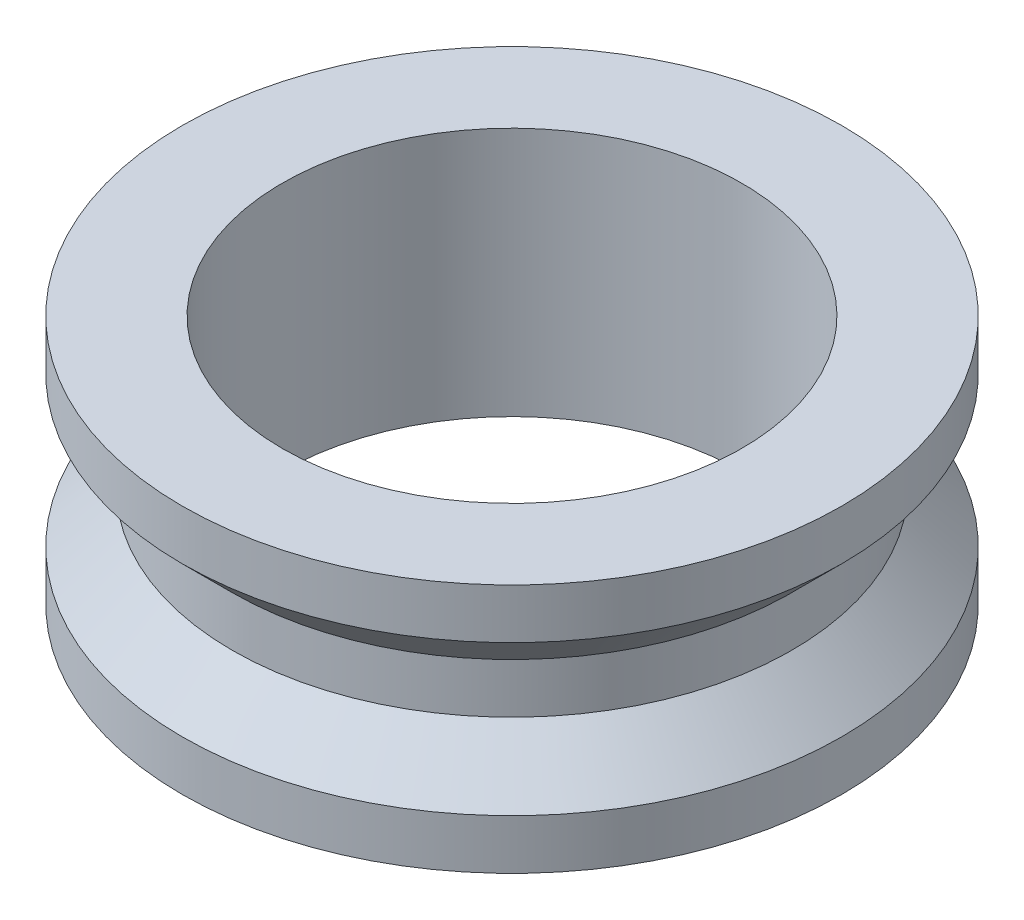
ISO-10303-21;
HEADER;
FILE_DESCRIPTION(('STEP AP214'),'2;1');
FILE_NAME('part.step','',(''),(''),'','','');
FILE_SCHEMA(('AUTOMOTIVE_DESIGN { 1 0 10303 214 1 1 1 1 }'));
ENDSEC;
DATA;
#1=APPLICATION_CONTEXT('core data for automotive mechanical design processes');
#2=APPLICATION_PROTOCOL_DEFINITION('international standard','automotive_design',2000,#1);
#3=PRODUCT_CONTEXT('',#1,'mechanical');
#4=PRODUCT('Part','Part','',(#3));
#5=PRODUCT_RELATED_PRODUCT_CATEGORY('part','',(#4));
#6=PRODUCT_DEFINITION_FORMATION('','',#4);
#7=PRODUCT_DEFINITION_CONTEXT('part definition',#1,'design');
#8=PRODUCT_DEFINITION('design','',#6,#7);
#9=PRODUCT_DEFINITION_SHAPE('','',#8);
#10=(LENGTH_UNIT() NAMED_UNIT(*) SI_UNIT(.MILLI.,.METRE.));
#11=(NAMED_UNIT(*) PLANE_ANGLE_UNIT() SI_UNIT($,.RADIAN.));
#12=(NAMED_UNIT(*) SI_UNIT($,.STERADIAN.) SOLID_ANGLE_UNIT());
#13=UNCERTAINTY_MEASURE_WITH_UNIT(LENGTH_MEASURE(1.E-05),#10,'distance_accuracy_value','');
#14=(GEOMETRIC_REPRESENTATION_CONTEXT(3) GLOBAL_UNCERTAINTY_ASSIGNED_CONTEXT((#13)) GLOBAL_UNIT_ASSIGNED_CONTEXT((#10,
#11,#12)) REPRESENTATION_CONTEXT('',''));
#15=CARTESIAN_POINT('',(0.,0.,0.));
#16=DIRECTION('',(0.,0.,1.));
#17=DIRECTION('',(1.,0.,0.));
#18=AXIS2_PLACEMENT_3D('',#15,#16,#17);
#19=CARTESIAN_POINT('',(0.,5.21595503291486,0.));
#20=DIRECTION('',(0.,1.,0.));
#21=DIRECTION('',(0.,0.,1.));
#22=AXIS2_PLACEMENT_3D('',#19,#20,#21);
#23=CYLINDRICAL_SURFACE('',#22,4.6);
#24=CARTESIAN_POINT('',(0.,5.,0.));
#25=DIRECTION('',(0.,1.,0.));
#26=DIRECTION('',(0.,0.,1.));
#27=AXIS2_PLACEMENT_3D('',#24,#25,#26);
#28=CIRCLE('',#27,4.6);
#29=CARTESIAN_POINT('',(0.,5.,4.6));
#30=VERTEX_POINT('',#29);
#31=EDGE_CURVE('E61',#30,#30,#28,.T.);
#32=ORIENTED_EDGE('',*,*,#31,.T.);
#33=EDGE_LOOP('',(#32));
#34=FACE_BOUND('',#33,.T.);
#35=CARTESIAN_POINT('',(0.,0.,0.));
#36=DIRECTION('',(0.,1.,0.));
#37=DIRECTION('',(0.,0.,1.));
#38=AXIS2_PLACEMENT_3D('',#35,#36,#37);
#39=CIRCLE('',#38,4.6);
#40=CARTESIAN_POINT('',(0.,0.,4.6));
#41=VERTEX_POINT('',#40);
#42=EDGE_CURVE('E10',#41,#41,#39,.T.);
#43=ORIENTED_EDGE('',*,*,#42,.F.);
#44=EDGE_LOOP('',(#43));
#45=FACE_BOUND('',#44,.T.);
#46=ADVANCED_FACE('F33',(#34,#45),#23,.F.);
#47=CARTESIAN_POINT('',(-4.6,0.,0.));
#48=DIRECTION('',(0.,-1.,0.));
#49=DIRECTION('',(0.,0.,-1.));
#50=AXIS2_PLACEMENT_3D('',#47,#48,#49);
#51=PLANE('',#50);
#52=ORIENTED_EDGE('',*,*,#42,.T.);
#53=EDGE_LOOP('',(#52));
#54=FACE_BOUND('',#53,.T.);
#55=CARTESIAN_POINT('',(0.,0.,0.));
#56=DIRECTION('',(0.,1.,0.));
#57=DIRECTION('',(0.,0.,1.));
#58=AXIS2_PLACEMENT_3D('',#55,#56,#57);
#59=CIRCLE('',#58,6.6);
#60=CARTESIAN_POINT('',(0.,0.,6.6));
#61=VERTEX_POINT('',#60);
#62=EDGE_CURVE('E39',#61,#61,#59,.T.);
#63=ORIENTED_EDGE('',*,*,#62,.F.);
#64=EDGE_LOOP('',(#63));
#65=FACE_BOUND('',#64,.T.);
#66=ADVANCED_FACE('F79',(#54,#65),#51,.T.);
#67=CARTESIAN_POINT('',(0.,5.21595503291486,0.));
#68=DIRECTION('',(0.,1.,0.));
#69=DIRECTION('',(0.,0.,1.));
#70=AXIS2_PLACEMENT_3D('',#67,#68,#69);
#71=CYLINDRICAL_SURFACE('',#70,6.6);
#72=ORIENTED_EDGE('',*,*,#62,.T.);
#73=EDGE_LOOP('',(#72));
#74=FACE_BOUND('',#73,.T.);
#75=CARTESIAN_POINT('',(0.,1.00000000000002,0.));
#76=DIRECTION('',(0.,1.,0.));
#77=DIRECTION('',(0.,0.,1.));
#78=AXIS2_PLACEMENT_3D('',#75,#76,#77);
#79=CIRCLE('',#78,6.6);
#80=CARTESIAN_POINT('',(0.,1.00000000000002,6.6));
#81=VERTEX_POINT('',#80);
#82=EDGE_CURVE('E43',#81,#81,#79,.T.);
#83=ORIENTED_EDGE('',*,*,#82,.F.);
#84=EDGE_LOOP('',(#83));
#85=FACE_BOUND('',#84,.T.);
#86=ADVANCED_FACE('F83',(#74,#85),#71,.T.);
#87=CARTESIAN_POINT('',(0.,2.,0.));
#88=DIRECTION('',(0.,-1.,0.));
#89=DIRECTION('',(0.,0.,-1.));
#90=AXIS2_PLACEMENT_3D('',#87,#88,#89);
#91=CONICAL_SURFACE('',#90,5.6,0.785398163397457);
#92=ORIENTED_EDGE('',*,*,#82,.T.);
#93=EDGE_LOOP('',(#92));
#94=FACE_BOUND('',#93,.T.);
#95=CARTESIAN_POINT('',(0.,2.,0.));
#96=DIRECTION('',(0.,1.,0.));
#97=DIRECTION('',(0.,0.,1.));
#98=AXIS2_PLACEMENT_3D('',#95,#96,#97);
#99=CIRCLE('',#98,5.6);
#100=CARTESIAN_POINT('',(0.,2.,5.6));
#101=VERTEX_POINT('',#100);
#102=EDGE_CURVE('E47',#101,#101,#99,.T.);
#103=ORIENTED_EDGE('',*,*,#102,.F.);
#104=EDGE_LOOP('',(#103));
#105=FACE_BOUND('',#104,.T.);
#106=ADVANCED_FACE('F87',(#94,#105),#91,.T.);
#107=CARTESIAN_POINT('',(0.,5.21595503291486,0.));
#108=DIRECTION('',(0.,1.,0.));
#109=DIRECTION('',(0.,0.,1.));
#110=AXIS2_PLACEMENT_3D('',#107,#108,#109);
#111=CYLINDRICAL_SURFACE('',#110,5.6);
#112=ORIENTED_EDGE('',*,*,#102,.T.);
#113=EDGE_LOOP('',(#112));
#114=FACE_BOUND('',#113,.T.);
#115=CARTESIAN_POINT('',(0.,3.,0.));
#116=DIRECTION('',(0.,1.,0.));
#117=DIRECTION('',(0.,0.,1.));
#118=AXIS2_PLACEMENT_3D('',#115,#116,#117);
#119=CIRCLE('',#118,5.6);
#120=CARTESIAN_POINT('',(0.,3.,5.6));
#121=VERTEX_POINT('',#120);
#122=EDGE_CURVE('E52',#121,#121,#119,.T.);
#123=ORIENTED_EDGE('',*,*,#122,.F.);
#124=EDGE_LOOP('',(#123));
#125=FACE_BOUND('',#124,.T.);
#126=ADVANCED_FACE('F93',(#114,#125),#111,.T.);
#127=CARTESIAN_POINT('',(0.,3.99999999999998,0.));
#128=DIRECTION('',(0.,1.,0.));
#129=DIRECTION('',(0.,0.,1.));
#130=AXIS2_PLACEMENT_3D('',#127,#128,#129);
#131=CONICAL_SURFACE('',#130,6.6,0.785398163397456);
#132=ORIENTED_EDGE('',*,*,#122,.T.);
#133=EDGE_LOOP('',(#132));
#134=FACE_BOUND('',#133,.T.);
#135=CARTESIAN_POINT('',(0.,3.99999999999998,0.));
#136=DIRECTION('',(0.,1.,0.));
#137=DIRECTION('',(0.,0.,1.));
#138=AXIS2_PLACEMENT_3D('',#135,#136,#137);
#139=CIRCLE('',#138,6.6);
#140=CARTESIAN_POINT('',(0.,3.99999999999998,6.6));
#141=VERTEX_POINT('',#140);
#142=EDGE_CURVE('E55',#141,#141,#139,.T.);
#143=ORIENTED_EDGE('',*,*,#142,.F.);
#144=EDGE_LOOP('',(#143));
#145=FACE_BOUND('',#144,.T.);
#146=ADVANCED_FACE('F75',(#134,#145),#131,.T.);
#147=CARTESIAN_POINT('',(0.,5.21595503291486,0.));
#148=DIRECTION('',(0.,1.,0.));
#149=DIRECTION('',(0.,0.,1.));
#150=AXIS2_PLACEMENT_3D('',#147,#148,#149);
#151=CYLINDRICAL_SURFACE('',#150,6.6);
#152=ORIENTED_EDGE('',*,*,#142,.T.);
#153=EDGE_LOOP('',(#152));
#154=FACE_BOUND('',#153,.T.);
#155=CARTESIAN_POINT('',(0.,5.,0.));
#156=DIRECTION('',(0.,1.,0.));
#157=DIRECTION('',(0.,0.,1.));
#158=AXIS2_PLACEMENT_3D('',#155,#156,#157);
#159=CIRCLE('',#158,6.6);
#160=CARTESIAN_POINT('',(0.,5.,6.6));
#161=VERTEX_POINT('',#160);
#162=EDGE_CURVE('E58',#161,#161,#159,.T.);
#163=ORIENTED_EDGE('',*,*,#162,.F.);
#164=EDGE_LOOP('',(#163));
#165=FACE_BOUND('',#164,.T.);
#166=ADVANCED_FACE('F69',(#154,#165),#151,.T.);
#167=CARTESIAN_POINT('',(-6.6,5.,0.));
#168=DIRECTION('',(0.,1.,0.));
#169=DIRECTION('',(0.,0.,1.));
#170=AXIS2_PLACEMENT_3D('',#167,#168,#169);
#171=PLANE('',#170);
#172=ORIENTED_EDGE('',*,*,#162,.T.);
#173=EDGE_LOOP('',(#172));
#174=FACE_BOUND('',#173,.T.);
#175=ORIENTED_EDGE('',*,*,#31,.F.);
#176=EDGE_LOOP('',(#175));
#177=FACE_BOUND('',#176,.T.);
#178=ADVANCED_FACE('F67',(#174,#177),#171,.T.);
#179=CLOSED_SHELL('',(#46,#66,#86,#106,#126,#146,#166,#178));
#180=MANIFOLD_SOLID_BREP('B2',#179);
#181=ADVANCED_BREP_SHAPE_REPRESENTATION('',(#18,#180),#14);
#182=SHAPE_DEFINITION_REPRESENTATION(#9,#181);
ENDSEC;
END-ISO-10303-21;
